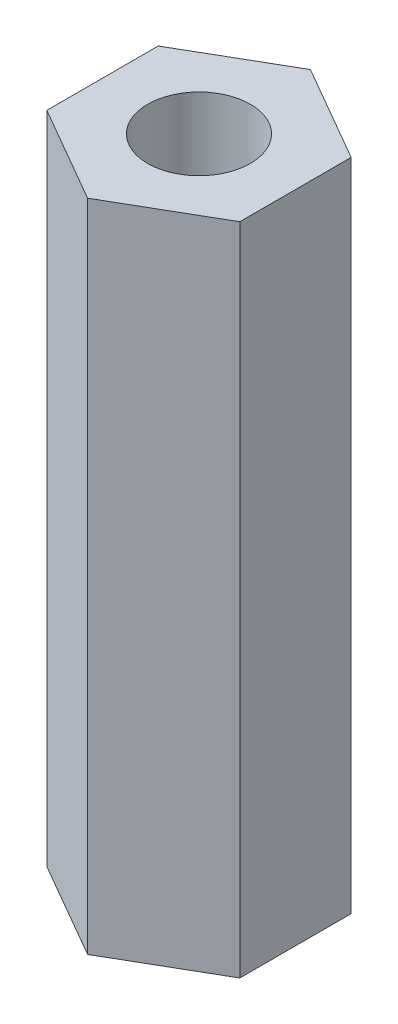
ISO-10303-21;
HEADER;
FILE_DESCRIPTION(('STEP AP214'),'2;1');
FILE_NAME('part.step','',(''),(''),'','','');
FILE_SCHEMA(('AUTOMOTIVE_DESIGN { 1 0 10303 214 1 1 1 1 }'));
ENDSEC;
DATA;
#1=APPLICATION_CONTEXT('core data for automotive mechanical design processes');
#2=APPLICATION_PROTOCOL_DEFINITION('international standard','automotive_design',2000,#1);
#3=PRODUCT_CONTEXT('',#1,'mechanical');
#4=PRODUCT('Part','Part','',(#3));
#5=PRODUCT_RELATED_PRODUCT_CATEGORY('part','',(#4));
#6=PRODUCT_DEFINITION_FORMATION('','',#4);
#7=PRODUCT_DEFINITION_CONTEXT('part definition',#1,'design');
#8=PRODUCT_DEFINITION('design','',#6,#7);
#9=PRODUCT_DEFINITION_SHAPE('','',#8);
#10=(LENGTH_UNIT() NAMED_UNIT(*) SI_UNIT(.MILLI.,.METRE.));
#11=(NAMED_UNIT(*) PLANE_ANGLE_UNIT() SI_UNIT($,.RADIAN.));
#12=(NAMED_UNIT(*) SI_UNIT($,.STERADIAN.) SOLID_ANGLE_UNIT());
#13=UNCERTAINTY_MEASURE_WITH_UNIT(LENGTH_MEASURE(1.E-05),#10,'distance_accuracy_value','');
#14=(GEOMETRIC_REPRESENTATION_CONTEXT(3) GLOBAL_UNCERTAINTY_ASSIGNED_CONTEXT((#13)) GLOBAL_UNIT_ASSIGNED_CONTEXT((#10,
#11,#12)) REPRESENTATION_CONTEXT('',''));
#15=CARTESIAN_POINT('',(0.,0.,0.));
#16=DIRECTION('',(0.,0.,1.));
#17=DIRECTION('',(1.,0.,0.));
#18=AXIS2_PLACEMENT_3D('',#15,#16,#17);
#19=CARTESIAN_POINT('',(0.,18.5,0.));
#20=DIRECTION('',(0.,1.,0.));
#21=DIRECTION('',(0.,0.,1.));
#22=AXIS2_PLACEMENT_3D('',#19,#20,#21);
#23=PLANE('',#22);
#24=DIRECTION('',(-0.866025403784439,0.,-0.5));
#25=VECTOR('',#24,1.);
#26=CARTESIAN_POINT('',(2.725,18.5,-1.57327948354173));
#27=LINE('',#26,#25);
#28=CARTESIAN_POINT('',(2.725,18.5,-1.57327948354173));
#29=VERTEX_POINT('',#28);
#30=CARTESIAN_POINT('',(0.,18.5,-3.14655896708346));
#31=VERTEX_POINT('',#30);
#32=EDGE_CURVE('E146',#29,#31,#27,.T.);
#33=ORIENTED_EDGE('',*,*,#32,.T.);
#34=DIRECTION('',(-0.866025403784439,0.,0.5));
#35=VECTOR('',#34,1.);
#36=CARTESIAN_POINT('',(0.,18.5,-3.14655896708346));
#37=LINE('',#36,#35);
#38=CARTESIAN_POINT('',(-2.725,18.5,-1.57327948354173));
#39=VERTEX_POINT('',#38);
#40=EDGE_CURVE('E94',#31,#39,#37,.T.);
#41=ORIENTED_EDGE('',*,*,#40,.T.);
#42=DIRECTION('',(0.,0.,1.));
#43=VECTOR('',#42,1.);
#44=CARTESIAN_POINT('',(-2.725,18.5,-1.57327948354173));
#45=LINE('',#44,#43);
#46=CARTESIAN_POINT('',(-2.725,18.5,1.57327948354173));
#47=VERTEX_POINT('',#46);
#48=EDGE_CURVE('E107',#39,#47,#45,.T.);
#49=ORIENTED_EDGE('',*,*,#48,.T.);
#50=DIRECTION('',(0.866025403784439,0.,0.5));
#51=VECTOR('',#50,1.);
#52=CARTESIAN_POINT('',(-2.725,18.5,1.57327948354173));
#53=LINE('',#52,#51);
#54=CARTESIAN_POINT('',(0.,18.5,3.14655896708346));
#55=VERTEX_POINT('',#54);
#56=EDGE_CURVE('E101',#47,#55,#53,.T.);
#57=ORIENTED_EDGE('',*,*,#56,.T.);
#58=DIRECTION('',(0.866025403784439,0.,-0.5));
#59=VECTOR('',#58,1.);
#60=CARTESIAN_POINT('',(0.,18.5,3.14655896708346));
#61=LINE('',#60,#59);
#62=CARTESIAN_POINT('',(2.725,18.5,1.57327948354173));
#63=VERTEX_POINT('',#62);
#64=EDGE_CURVE('E105',#55,#63,#61,.T.);
#65=ORIENTED_EDGE('',*,*,#64,.T.);
#66=DIRECTION('',(0.,0.,-1.));
#67=VECTOR('',#66,1.);
#68=CARTESIAN_POINT('',(2.725,18.5,1.57327948354173));
#69=LINE('',#68,#67);
#70=EDGE_CURVE('E57',#63,#29,#69,.T.);
#71=ORIENTED_EDGE('',*,*,#70,.T.);
#72=EDGE_LOOP('',(#33,#41,#49,#57,#65,#71));
#73=FACE_BOUND('',#72,.T.);
#74=CARTESIAN_POINT('',(0.,18.5,0.));
#75=DIRECTION('',(0.,1.,0.));
#76=DIRECTION('',(0.,0.,1.));
#77=AXIS2_PLACEMENT_3D('',#74,#75,#76);
#78=CIRCLE('',#77,1.45);
#79=CARTESIAN_POINT('',(0.,18.5,1.45));
#80=VERTEX_POINT('',#79);
#81=EDGE_CURVE('E134',#80,#80,#78,.T.);
#82=ORIENTED_EDGE('',*,*,#81,.F.);
#83=EDGE_LOOP('',(#82));
#84=FACE_BOUND('',#83,.T.);
#85=ADVANCED_FACE('F39',(#73,#84),#23,.T.);
#86=CARTESIAN_POINT('',(0.,0.,0.));
#87=DIRECTION('',(0.,1.,0.));
#88=DIRECTION('',(0.,0.,1.));
#89=AXIS2_PLACEMENT_3D('',#86,#87,#88);
#90=PLANE('',#89);
#91=DIRECTION('',(-0.866025403784439,0.,-0.5));
#92=VECTOR('',#91,1.);
#93=CARTESIAN_POINT('',(2.725,0.,-1.57327948354173));
#94=LINE('',#93,#92);
#95=CARTESIAN_POINT('',(2.725,0.,-1.57327948354173));
#96=VERTEX_POINT('',#95);
#97=CARTESIAN_POINT('',(0.,0.,-3.14655896708346));
#98=VERTEX_POINT('',#97);
#99=EDGE_CURVE('E129',#96,#98,#94,.T.);
#100=ORIENTED_EDGE('',*,*,#99,.F.);
#101=DIRECTION('',(0.,0.,-1.));
#102=VECTOR('',#101,1.);
#103=CARTESIAN_POINT('',(2.725,0.,1.57327948354173));
#104=LINE('',#103,#102);
#105=CARTESIAN_POINT('',(2.725,0.,1.57327948354173));
#106=VERTEX_POINT('',#105);
#107=EDGE_CURVE('E86',#106,#96,#104,.T.);
#108=ORIENTED_EDGE('',*,*,#107,.F.);
#109=DIRECTION('',(0.866025403784439,0.,-0.5));
#110=VECTOR('',#109,1.);
#111=CARTESIAN_POINT('',(0.,0.,3.14655896708346));
#112=LINE('',#111,#110);
#113=CARTESIAN_POINT('',(0.,0.,3.14655896708346));
#114=VERTEX_POINT('',#113);
#115=EDGE_CURVE('E80',#114,#106,#112,.T.);
#116=ORIENTED_EDGE('',*,*,#115,.F.);
#117=DIRECTION('',(0.866025403784439,0.,0.5));
#118=VECTOR('',#117,1.);
#119=CARTESIAN_POINT('',(-2.725,0.,1.57327948354173));
#120=LINE('',#119,#118);
#121=CARTESIAN_POINT('',(-2.725,0.,1.57327948354173));
#122=VERTEX_POINT('',#121);
#123=EDGE_CURVE('E116',#122,#114,#120,.T.);
#124=ORIENTED_EDGE('',*,*,#123,.F.);
#125=DIRECTION('',(0.,0.,1.));
#126=VECTOR('',#125,1.);
#127=CARTESIAN_POINT('',(-2.725,0.,-1.57327948354173));
#128=LINE('',#127,#126);
#129=CARTESIAN_POINT('',(-2.725,0.,-1.57327948354173));
#130=VERTEX_POINT('',#129);
#131=EDGE_CURVE('E137',#130,#122,#128,.T.);
#132=ORIENTED_EDGE('',*,*,#131,.F.);
#133=DIRECTION('',(-0.866025403784439,0.,0.5));
#134=VECTOR('',#133,1.);
#135=CARTESIAN_POINT('',(0.,0.,-3.14655896708346));
#136=LINE('',#135,#134);
#137=EDGE_CURVE('E133',#98,#130,#136,.T.);
#138=ORIENTED_EDGE('',*,*,#137,.F.);
#139=EDGE_LOOP('',(#100,#108,#116,#124,#132,#138));
#140=FACE_BOUND('',#139,.T.);
#141=CARTESIAN_POINT('',(0.,0.,0.));
#142=DIRECTION('',(0.,1.,0.));
#143=DIRECTION('',(0.,0.,1.));
#144=AXIS2_PLACEMENT_3D('',#141,#142,#143);
#145=CIRCLE('',#144,1.45);
#146=CARTESIAN_POINT('',(0.,0.,1.45));
#147=VERTEX_POINT('',#146);
#148=EDGE_CURVE('E243',#147,#147,#145,.T.);
#149=ORIENTED_EDGE('',*,*,#148,.T.);
#150=EDGE_LOOP('',(#149));
#151=FACE_BOUND('',#150,.T.);
#152=ADVANCED_FACE('F159',(#140,#151),#90,.F.);
#153=CARTESIAN_POINT('',(2.725,18.5,-1.57327948354173));
#154=DIRECTION('',(-0.5,0.,0.866025403784439));
#155=DIRECTION('',(0.866025403784439,0.,0.5));
#156=AXIS2_PLACEMENT_3D('',#153,#154,#155);
#157=PLANE('',#156);
#158=ORIENTED_EDGE('',*,*,#99,.T.);
#159=DIRECTION('',(0.,-1.,0.));
#160=VECTOR('',#159,1.);
#161=CARTESIAN_POINT('',(0.,18.5,-3.14655896708346));
#162=LINE('',#161,#160);
#163=EDGE_CURVE('E11',#31,#98,#162,.T.);
#164=ORIENTED_EDGE('',*,*,#163,.F.);
#165=ORIENTED_EDGE('',*,*,#32,.F.);
#166=DIRECTION('',(0.,-1.,0.));
#167=VECTOR('',#166,1.);
#168=CARTESIAN_POINT('',(2.725,18.5,-1.57327948354173));
#169=LINE('',#168,#167);
#170=EDGE_CURVE('E125',#29,#96,#169,.T.);
#171=ORIENTED_EDGE('',*,*,#170,.T.);
#172=EDGE_LOOP('',(#158,#164,#165,#171));
#173=FACE_BOUND('',#172,.T.);
#174=ADVANCED_FACE('F41',(#173),#157,.F.);
#175=CARTESIAN_POINT('',(0.,18.5,-3.14655896708346));
#176=DIRECTION('',(0.5,0.,0.866025403784439));
#177=DIRECTION('',(0.866025403784439,0.,-0.5));
#178=AXIS2_PLACEMENT_3D('',#175,#176,#177);
#179=PLANE('',#178);
#180=ORIENTED_EDGE('',*,*,#137,.T.);
#181=DIRECTION('',(0.,-1.,0.));
#182=VECTOR('',#181,1.);
#183=CARTESIAN_POINT('',(-2.725,18.5,-1.57327948354173));
#184=LINE('',#183,#182);
#185=EDGE_CURVE('E49',#39,#130,#184,.T.);
#186=ORIENTED_EDGE('',*,*,#185,.F.);
#187=ORIENTED_EDGE('',*,*,#40,.F.);
#188=ORIENTED_EDGE('',*,*,#163,.T.);
#189=EDGE_LOOP('',(#180,#186,#187,#188));
#190=FACE_BOUND('',#189,.T.);
#191=ADVANCED_FACE('F184',(#190),#179,.F.);
#192=CARTESIAN_POINT('',(-2.725,18.5,-1.57327948354173));
#193=DIRECTION('',(1.,0.,0.));
#194=DIRECTION('',(0.,0.,-1.));
#195=AXIS2_PLACEMENT_3D('',#192,#193,#194);
#196=PLANE('',#195);
#197=ORIENTED_EDGE('',*,*,#131,.T.);
#198=DIRECTION('',(0.,-1.,0.));
#199=VECTOR('',#198,1.);
#200=CARTESIAN_POINT('',(-2.725,18.5,1.57327948354173));
#201=LINE('',#200,#199);
#202=EDGE_CURVE('E118',#47,#122,#201,.T.);
#203=ORIENTED_EDGE('',*,*,#202,.F.);
#204=ORIENTED_EDGE('',*,*,#48,.F.);
#205=ORIENTED_EDGE('',*,*,#185,.T.);
#206=EDGE_LOOP('',(#197,#203,#204,#205));
#207=FACE_BOUND('',#206,.T.);
#208=ADVANCED_FACE('F156',(#207),#196,.F.);
#209=CARTESIAN_POINT('',(-2.725,18.5,1.57327948354173));
#210=DIRECTION('',(0.5,0.,-0.866025403784439));
#211=DIRECTION('',(-0.866025403784439,0.,-0.5));
#212=AXIS2_PLACEMENT_3D('',#209,#210,#211);
#213=PLANE('',#212);
#214=ORIENTED_EDGE('',*,*,#123,.T.);
#215=DIRECTION('',(0.,-1.,0.));
#216=VECTOR('',#215,1.);
#217=CARTESIAN_POINT('',(0.,18.5,3.14655896708346));
#218=LINE('',#217,#216);
#219=EDGE_CURVE('E113',#55,#114,#218,.T.);
#220=ORIENTED_EDGE('',*,*,#219,.F.);
#221=ORIENTED_EDGE('',*,*,#56,.F.);
#222=ORIENTED_EDGE('',*,*,#202,.T.);
#223=EDGE_LOOP('',(#214,#220,#221,#222));
#224=FACE_BOUND('',#223,.T.);
#225=ADVANCED_FACE('F114',(#224),#213,.F.);
#226=CARTESIAN_POINT('',(0.,18.5,3.14655896708346));
#227=DIRECTION('',(-0.5,0.,-0.866025403784439));
#228=DIRECTION('',(-0.866025403784439,0.,0.5));
#229=AXIS2_PLACEMENT_3D('',#226,#227,#228);
#230=PLANE('',#229);
#231=ORIENTED_EDGE('',*,*,#115,.T.);
#232=DIRECTION('',(0.,-1.,0.));
#233=VECTOR('',#232,1.);
#234=CARTESIAN_POINT('',(2.725,18.5,1.57327948354173));
#235=LINE('',#234,#233);
#236=EDGE_CURVE('E119',#63,#106,#235,.T.);
#237=ORIENTED_EDGE('',*,*,#236,.F.);
#238=ORIENTED_EDGE('',*,*,#64,.F.);
#239=ORIENTED_EDGE('',*,*,#219,.T.);
#240=EDGE_LOOP('',(#231,#237,#238,#239));
#241=FACE_BOUND('',#240,.T.);
#242=ADVANCED_FACE('F121',(#241),#230,.F.);
#243=CARTESIAN_POINT('',(2.725,18.5,1.57327948354173));
#244=DIRECTION('',(-1.,0.,0.));
#245=DIRECTION('',(0.,0.,1.));
#246=AXIS2_PLACEMENT_3D('',#243,#244,#245);
#247=PLANE('',#246);
#248=ORIENTED_EDGE('',*,*,#107,.T.);
#249=ORIENTED_EDGE('',*,*,#170,.F.);
#250=ORIENTED_EDGE('',*,*,#70,.F.);
#251=ORIENTED_EDGE('',*,*,#236,.T.);
#252=EDGE_LOOP('',(#248,#249,#250,#251));
#253=FACE_BOUND('',#252,.T.);
#254=ADVANCED_FACE('F164',(#253),#247,.F.);
#255=CARTESIAN_POINT('',(0.,18.5,0.));
#256=DIRECTION('',(0.,-1.,0.));
#257=DIRECTION('',(0.,0.,-1.));
#258=AXIS2_PLACEMENT_3D('',#255,#256,#257);
#259=CYLINDRICAL_SURFACE('',#258,1.45);
#260=ORIENTED_EDGE('',*,*,#81,.T.);
#261=EDGE_LOOP('',(#260));
#262=FACE_BOUND('',#261,.T.);
#263=ORIENTED_EDGE('',*,*,#148,.F.);
#264=EDGE_LOOP('',(#263));
#265=FACE_BOUND('',#264,.T.);
#266=ADVANCED_FACE('F166',(#262,#265),#259,.F.);
#267=CLOSED_SHELL('',(#85,#152,#174,#191,#208,#225,#242,#254,#266));
#268=MANIFOLD_SOLID_BREP('B2',#267);
#269=ADVANCED_BREP_SHAPE_REPRESENTATION('',(#18,#268),#14);
#270=SHAPE_DEFINITION_REPRESENTATION(#9,#269);
ENDSEC;
END-ISO-10303-21;
